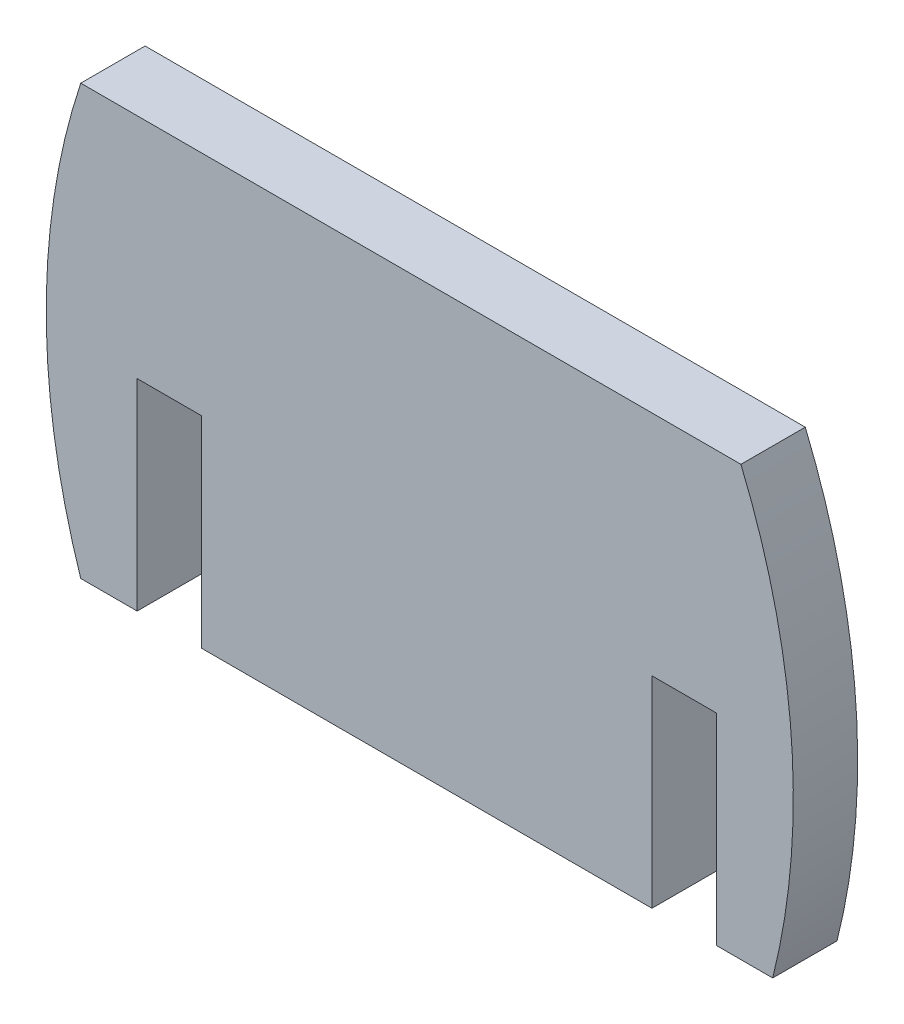
ISO-10303-21;
HEADER;
FILE_DESCRIPTION(('STEP AP214'),'2;1');
FILE_NAME('part.step','',(''),(''),'','','');
FILE_SCHEMA(('AUTOMOTIVE_DESIGN { 1 0 10303 214 1 1 1 1 }'));
ENDSEC;
DATA;
#1=APPLICATION_CONTEXT('core data for automotive mechanical design processes');
#2=APPLICATION_PROTOCOL_DEFINITION('international standard','automotive_design',2000,#1);
#3=PRODUCT_CONTEXT('',#1,'mechanical');
#4=PRODUCT('Part','Part','',(#3));
#5=PRODUCT_RELATED_PRODUCT_CATEGORY('part','',(#4));
#6=PRODUCT_DEFINITION_FORMATION('','',#4);
#7=PRODUCT_DEFINITION_CONTEXT('part definition',#1,'design');
#8=PRODUCT_DEFINITION('design','',#6,#7);
#9=PRODUCT_DEFINITION_SHAPE('','',#8);
#10=(LENGTH_UNIT() NAMED_UNIT(*) SI_UNIT(.MILLI.,.METRE.));
#11=(NAMED_UNIT(*) PLANE_ANGLE_UNIT() SI_UNIT($,.RADIAN.));
#12=(NAMED_UNIT(*) SI_UNIT($,.STERADIAN.) SOLID_ANGLE_UNIT());
#13=UNCERTAINTY_MEASURE_WITH_UNIT(LENGTH_MEASURE(1.E-05),#10,'distance_accuracy_value','');
#14=(GEOMETRIC_REPRESENTATION_CONTEXT(3) GLOBAL_UNCERTAINTY_ASSIGNED_CONTEXT((#13)) GLOBAL_UNIT_ASSIGNED_CONTEXT((#10,
#11,#12)) REPRESENTATION_CONTEXT('',''));
#15=CARTESIAN_POINT('',(0.,0.,0.));
#16=DIRECTION('',(0.,0.,1.));
#17=DIRECTION('',(1.,0.,0.));
#18=AXIS2_PLACEMENT_3D('',#15,#16,#17);
#19=CARTESIAN_POINT('',(905.965375707965,-101.027413416777,3.00000000000009));
#20=DIRECTION('',(1.,0.,0.));
#21=DIRECTION('',(0.,0.,-1.));
#22=AXIS2_PLACEMENT_3D('',#19,#20,#21);
#23=PLANE('',#22);
#24=DIRECTION('',(0.,-1.,0.));
#25=VECTOR('',#24,1.);
#26=CARTESIAN_POINT('',(905.965375707965,-101.027413416777,0.));
#27=LINE('',#26,#25);
#28=CARTESIAN_POINT('',(905.965375707965,-101.027413416777,0.));
#29=VERTEX_POINT('',#28);
#30=CARTESIAN_POINT('',(905.965375707965,-110.414681889517,0.));
#31=VERTEX_POINT('',#30);
#32=EDGE_CURVE('E124',#29,#31,#27,.T.);
#33=ORIENTED_EDGE('',*,*,#32,.T.);
#34=DIRECTION('',(0.,0.,-1.));
#35=VECTOR('',#34,1.);
#36=CARTESIAN_POINT('',(905.965375707965,-110.414681889517,3.00000000000004));
#37=LINE('',#36,#35);
#38=CARTESIAN_POINT('',(905.965375707965,-110.414681889517,3.00000000000004));
#39=VERTEX_POINT('',#38);
#40=EDGE_CURVE('E11',#39,#31,#37,.T.);
#41=ORIENTED_EDGE('',*,*,#40,.F.);
#42=DIRECTION('',(0.,-1.,0.));
#43=VECTOR('',#42,1.);
#44=CARTESIAN_POINT('',(905.965375707965,-101.027413416777,3.00000000000009));
#45=LINE('',#44,#43);
#46=CARTESIAN_POINT('',(905.965375707965,-101.027413416777,3.00000000000009));
#47=VERTEX_POINT('',#46);
#48=EDGE_CURVE('E160',#47,#39,#45,.T.);
#49=ORIENTED_EDGE('',*,*,#48,.F.);
#50=DIRECTION('',(0.,0.,-1.));
#51=VECTOR('',#50,1.);
#52=CARTESIAN_POINT('',(905.965375707965,-101.027413416777,3.00000000000009));
#53=LINE('',#52,#51);
#54=EDGE_CURVE('E137',#47,#29,#53,.T.);
#55=ORIENTED_EDGE('',*,*,#54,.T.);
#56=EDGE_LOOP('',(#33,#41,#49,#55));
#57=FACE_BOUND('',#56,.T.);
#58=ADVANCED_FACE('F32',(#57),#23,.F.);
#59=CARTESIAN_POINT('',(905.965375707965,-110.414681889517,3.00000000000004));
#60=DIRECTION('',(0.,1.,0.));
#61=DIRECTION('',(0.,0.,1.));
#62=AXIS2_PLACEMENT_3D('',#59,#60,#61);
#63=PLANE('',#62);
#64=DIRECTION('',(1.,0.,0.));
#65=VECTOR('',#64,1.);
#66=CARTESIAN_POINT('',(905.965375707965,-110.414681889517,0.));
#67=LINE('',#66,#65);
#68=CARTESIAN_POINT('',(908.594990658527,-110.414681889517,0.));
#69=VERTEX_POINT('',#68);
#70=EDGE_CURVE('E120',#31,#69,#67,.T.);
#71=ORIENTED_EDGE('',*,*,#70,.T.);
#72=DIRECTION('',(0.,0.,-1.));
#73=VECTOR('',#72,1.);
#74=CARTESIAN_POINT('',(908.594990658527,-110.414681889517,3.00000000000011));
#75=LINE('',#74,#73);
#76=CARTESIAN_POINT('',(908.594990658527,-110.414681889517,3.00000000000011));
#77=VERTEX_POINT('',#76);
#78=EDGE_CURVE('E39',#77,#69,#75,.T.);
#79=ORIENTED_EDGE('',*,*,#78,.F.);
#80=DIRECTION('',(1.,0.,0.));
#81=VECTOR('',#80,1.);
#82=CARTESIAN_POINT('',(905.965375707965,-110.414681889517,3.00000000000004));
#83=LINE('',#82,#81);
#84=EDGE_CURVE('E133',#39,#77,#83,.T.);
#85=ORIENTED_EDGE('',*,*,#84,.F.);
#86=ORIENTED_EDGE('',*,*,#40,.T.);
#87=EDGE_LOOP('',(#71,#79,#85,#86));
#88=FACE_BOUND('',#87,.T.);
#89=ADVANCED_FACE('F132',(#88),#63,.F.);
#90=CARTESIAN_POINT('',(877.680521732813,-102.649008524701,3.00000000000016));
#91=DIRECTION('',(0.,0.,-1.));
#92=DIRECTION('',(-1.,0.,0.));
#93=AXIS2_PLACEMENT_3D('',#90,#91,#92);
#94=CYLINDRICAL_SURFACE('',#93,31.8749128903584);
#95=CARTESIAN_POINT('',(877.680521732813,-102.649008524701,1.11022302462516E-13));
#96=DIRECTION('',(0.,0.,1.));
#97=DIRECTION('',(1.,0.,0.));
#98=AXIS2_PLACEMENT_3D('',#95,#96,#97);
#99=CIRCLE('',#98,31.8749128903584);
#100=CARTESIAN_POINT('',(907.114028549901,-90.4146818895168,0.));
#101=VERTEX_POINT('',#100);
#102=EDGE_CURVE('E126',#69,#101,#99,.T.);
#103=ORIENTED_EDGE('',*,*,#102,.T.);
#104=DIRECTION('',(0.,0.,-1.));
#105=VECTOR('',#104,1.);
#106=CARTESIAN_POINT('',(907.114028549901,-90.4146818895168,3.0000000000001));
#107=LINE('',#106,#105);
#108=CARTESIAN_POINT('',(907.114028549901,-90.4146818895168,3.0000000000001));
#109=VERTEX_POINT('',#108);
#110=EDGE_CURVE('E206',#109,#101,#107,.T.);
#111=ORIENTED_EDGE('',*,*,#110,.F.);
#112=CARTESIAN_POINT('',(877.680521732813,-102.649008524701,3.00000000000016));
#113=DIRECTION('',(0.,0.,1.));
#114=DIRECTION('',(1.,0.,0.));
#115=AXIS2_PLACEMENT_3D('',#112,#113,#114);
#116=CIRCLE('',#115,31.8749128903584);
#117=EDGE_CURVE('E163',#77,#109,#116,.T.);
#118=ORIENTED_EDGE('',*,*,#117,.F.);
#119=ORIENTED_EDGE('',*,*,#78,.T.);
#120=EDGE_LOOP('',(#103,#111,#118,#119));
#121=FACE_BOUND('',#120,.T.);
#122=ADVANCED_FACE('F210',(#121),#94,.T.);
#123=CARTESIAN_POINT('',(876.335760757402,-90.4146818895168,3.00000000000011));
#124=DIRECTION('',(0.,-1.,0.));
#125=DIRECTION('',(1.,0.,0.));
#126=AXIS2_PLACEMENT_3D('',#123,#124,#125);
#127=PLANE('',#126);
#128=DIRECTION('',(-1.,0.,0.));
#129=VECTOR('',#128,1.);
#130=CARTESIAN_POINT('',(876.335760757402,-90.4146818895167,0.));
#131=LINE('',#130,#129);
#132=CARTESIAN_POINT('',(876.335760757402,-90.4146818895167,0.));
#133=VERTEX_POINT('',#132);
#134=EDGE_CURVE('E141',#101,#133,#131,.T.);
#135=ORIENTED_EDGE('',*,*,#134,.T.);
#136=DIRECTION('',(0.,0.,-1.));
#137=VECTOR('',#136,1.);
#138=CARTESIAN_POINT('',(876.335760757402,-90.4146818895168,3.00000000000011));
#139=LINE('',#138,#137);
#140=CARTESIAN_POINT('',(876.335760757402,-90.4146818895168,3.00000000000011));
#141=VERTEX_POINT('',#140);
#142=EDGE_CURVE('E203',#141,#133,#139,.T.);
#143=ORIENTED_EDGE('',*,*,#142,.F.);
#144=DIRECTION('',(-1.,0.,0.));
#145=VECTOR('',#144,1.);
#146=CARTESIAN_POINT('',(876.335760757402,-90.4146818895168,3.00000000000011));
#147=LINE('',#146,#145);
#148=EDGE_CURVE('E165',#109,#141,#147,.T.);
#149=ORIENTED_EDGE('',*,*,#148,.F.);
#150=ORIENTED_EDGE('',*,*,#110,.T.);
#151=EDGE_LOOP('',(#135,#143,#149,#150));
#152=FACE_BOUND('',#151,.T.);
#153=ADVANCED_FACE('F218',(#152),#127,.F.);
#154=CARTESIAN_POINT('',(906.601419048078,-100.414681889517,3.00000000000017));
#155=DIRECTION('',(0.,0.,-1.));
#156=DIRECTION('',(-1.,0.,0.));
#157=AXIS2_PLACEMENT_3D('',#154,#155,#156);
#158=CYLINDRICAL_SURFACE('',#157,31.8749128903585);
#159=CARTESIAN_POINT('',(906.601419048078,-100.414681889517,1.38777878078145E-13));
#160=DIRECTION('',(0.,0.,1.));
#161=DIRECTION('',(1.,0.,0.));
#162=AXIS2_PLACEMENT_3D('',#159,#160,#161);
#163=CIRCLE('',#162,31.8749128903585);
#164=CARTESIAN_POINT('',(876.335760757402,-110.414681889517,1.11022302462516E-13));
#165=VERTEX_POINT('',#164);
#166=EDGE_CURVE('E143',#133,#165,#163,.T.);
#167=ORIENTED_EDGE('',*,*,#166,.T.);
#168=DIRECTION('',(0.,0.,-1.));
#169=VECTOR('',#168,1.);
#170=CARTESIAN_POINT('',(876.335760757402,-110.414681889517,3.00000000000007));
#171=LINE('',#170,#169);
#172=CARTESIAN_POINT('',(876.335760757402,-110.414681889517,3.00000000000007));
#173=VERTEX_POINT('',#172);
#174=EDGE_CURVE('E200',#173,#165,#171,.T.);
#175=ORIENTED_EDGE('',*,*,#174,.F.);
#176=CARTESIAN_POINT('',(906.601419048078,-100.414681889517,3.00000000000017));
#177=DIRECTION('',(0.,0.,1.));
#178=DIRECTION('',(1.,0.,0.));
#179=AXIS2_PLACEMENT_3D('',#176,#177,#178);
#180=CIRCLE('',#179,31.8749128903585);
#181=EDGE_CURVE('E167',#141,#173,#180,.T.);
#182=ORIENTED_EDGE('',*,*,#181,.F.);
#183=ORIENTED_EDGE('',*,*,#142,.T.);
#184=EDGE_LOOP('',(#167,#175,#182,#183));
#185=FACE_BOUND('',#184,.T.);
#186=ADVANCED_FACE('F221',(#185),#158,.T.);
#187=CARTESIAN_POINT('',(878.965375707965,-110.414681889517,3.00000000000007));
#188=DIRECTION('',(0.,1.,0.));
#189=DIRECTION('',(0.,0.,1.));
#190=AXIS2_PLACEMENT_3D('',#187,#188,#189);
#191=PLANE('',#190);
#192=DIRECTION('',(1.,0.,0.));
#193=VECTOR('',#192,1.);
#194=CARTESIAN_POINT('',(878.965375707965,-110.414681889517,0.));
#195=LINE('',#194,#193);
#196=CARTESIAN_POINT('',(878.965375707965,-110.414681889517,0.));
#197=VERTEX_POINT('',#196);
#198=EDGE_CURVE('E145',#165,#197,#195,.T.);
#199=ORIENTED_EDGE('',*,*,#198,.T.);
#200=DIRECTION('',(0.,0.,-1.));
#201=VECTOR('',#200,1.);
#202=CARTESIAN_POINT('',(878.965375707965,-110.414681889517,3.00000000000007));
#203=LINE('',#202,#201);
#204=CARTESIAN_POINT('',(878.965375707965,-110.414681889517,3.00000000000007));
#205=VERTEX_POINT('',#204);
#206=EDGE_CURVE('E197',#205,#197,#203,.T.);
#207=ORIENTED_EDGE('',*,*,#206,.F.);
#208=DIRECTION('',(1.,0.,0.));
#209=VECTOR('',#208,1.);
#210=CARTESIAN_POINT('',(878.965375707965,-110.414681889517,3.00000000000007));
#211=LINE('',#210,#209);
#212=EDGE_CURVE('E169',#173,#205,#211,.T.);
#213=ORIENTED_EDGE('',*,*,#212,.F.);
#214=ORIENTED_EDGE('',*,*,#174,.T.);
#215=EDGE_LOOP('',(#199,#207,#213,#214));
#216=FACE_BOUND('',#215,.T.);
#217=ADVANCED_FACE('F226',(#216),#191,.F.);
#218=CARTESIAN_POINT('',(878.965375707965,-101.027413416777,3.0000000000001));
#219=DIRECTION('',(-1.,0.,0.));
#220=DIRECTION('',(0.,0.,1.));
#221=AXIS2_PLACEMENT_3D('',#218,#219,#220);
#222=PLANE('',#221);
#223=DIRECTION('',(0.,1.,0.));
#224=VECTOR('',#223,1.);
#225=CARTESIAN_POINT('',(878.965375707965,-101.027413416777,0.));
#226=LINE('',#225,#224);
#227=CARTESIAN_POINT('',(878.965375707965,-101.027413416777,0.));
#228=VERTEX_POINT('',#227);
#229=EDGE_CURVE('E147',#197,#228,#226,.T.);
#230=ORIENTED_EDGE('',*,*,#229,.T.);
#231=DIRECTION('',(0.,0.,-1.));
#232=VECTOR('',#231,1.);
#233=CARTESIAN_POINT('',(878.965375707965,-101.027413416777,3.0000000000001));
#234=LINE('',#233,#232);
#235=CARTESIAN_POINT('',(878.965375707965,-101.027413416777,3.0000000000001));
#236=VERTEX_POINT('',#235);
#237=EDGE_CURVE('E194',#236,#228,#234,.T.);
#238=ORIENTED_EDGE('',*,*,#237,.F.);
#239=DIRECTION('',(0.,1.,0.));
#240=VECTOR('',#239,1.);
#241=CARTESIAN_POINT('',(878.965375707965,-101.027413416777,3.0000000000001));
#242=LINE('',#241,#240);
#243=EDGE_CURVE('E171',#205,#236,#242,.T.);
#244=ORIENTED_EDGE('',*,*,#243,.F.);
#245=ORIENTED_EDGE('',*,*,#206,.T.);
#246=EDGE_LOOP('',(#230,#238,#244,#245));
#247=FACE_BOUND('',#246,.T.);
#248=ADVANCED_FACE('F232',(#247),#222,.F.);
#249=CARTESIAN_POINT('',(881.965375707965,-101.027413416777,3.00000000000016));
#250=DIRECTION('',(0.,1.,0.));
#251=DIRECTION('',(0.,0.,1.));
#252=AXIS2_PLACEMENT_3D('',#249,#250,#251);
#253=PLANE('',#252);
#254=DIRECTION('',(1.,0.,0.));
#255=VECTOR('',#254,1.);
#256=CARTESIAN_POINT('',(881.965375707965,-101.027413416777,0.));
#257=LINE('',#256,#255);
#258=CARTESIAN_POINT('',(881.965375707965,-101.027413416777,0.));
#259=VERTEX_POINT('',#258);
#260=EDGE_CURVE('E149',#228,#259,#257,.T.);
#261=ORIENTED_EDGE('',*,*,#260,.T.);
#262=DIRECTION('',(0.,0.,-1.));
#263=VECTOR('',#262,1.);
#264=CARTESIAN_POINT('',(881.965375707965,-101.027413416777,3.00000000000016));
#265=LINE('',#264,#263);
#266=CARTESIAN_POINT('',(881.965375707965,-101.027413416777,3.00000000000016));
#267=VERTEX_POINT('',#266);
#268=EDGE_CURVE('E191',#267,#259,#265,.T.);
#269=ORIENTED_EDGE('',*,*,#268,.F.);
#270=DIRECTION('',(1.,0.,0.));
#271=VECTOR('',#270,1.);
#272=CARTESIAN_POINT('',(881.965375707965,-101.027413416777,3.00000000000016));
#273=LINE('',#272,#271);
#274=EDGE_CURVE('E173',#236,#267,#273,.T.);
#275=ORIENTED_EDGE('',*,*,#274,.F.);
#276=ORIENTED_EDGE('',*,*,#237,.T.);
#277=EDGE_LOOP('',(#261,#269,#275,#276));
#278=FACE_BOUND('',#277,.T.);
#279=ADVANCED_FACE('F236',(#278),#253,.F.);
#280=CARTESIAN_POINT('',(881.965375707965,-110.414681889517,3.00000000000007));
#281=DIRECTION('',(1.,0.,0.));
#282=DIRECTION('',(0.,0.,-1.));
#283=AXIS2_PLACEMENT_3D('',#280,#281,#282);
#284=PLANE('',#283);
#285=DIRECTION('',(0.,-1.,0.));
#286=VECTOR('',#285,1.);
#287=CARTESIAN_POINT('',(881.965375707965,-110.414681889517,1.38777878078145E-13));
#288=LINE('',#287,#286);
#289=CARTESIAN_POINT('',(881.965375707965,-110.414681889517,1.38777878078145E-13));
#290=VERTEX_POINT('',#289);
#291=EDGE_CURVE('E151',#259,#290,#288,.T.);
#292=ORIENTED_EDGE('',*,*,#291,.T.);
#293=DIRECTION('',(0.,0.,-1.));
#294=VECTOR('',#293,1.);
#295=CARTESIAN_POINT('',(881.965375707965,-110.414681889517,3.00000000000007));
#296=LINE('',#295,#294);
#297=CARTESIAN_POINT('',(881.965375707965,-110.414681889517,3.00000000000007));
#298=VERTEX_POINT('',#297);
#299=EDGE_CURVE('E188',#298,#290,#296,.T.);
#300=ORIENTED_EDGE('',*,*,#299,.F.);
#301=DIRECTION('',(0.,-1.,0.));
#302=VECTOR('',#301,1.);
#303=CARTESIAN_POINT('',(881.965375707965,-110.414681889517,3.00000000000007));
#304=LINE('',#303,#302);
#305=EDGE_CURVE('E175',#267,#298,#304,.T.);
#306=ORIENTED_EDGE('',*,*,#305,.F.);
#307=ORIENTED_EDGE('',*,*,#268,.T.);
#308=EDGE_LOOP('',(#292,#300,#306,#307));
#309=FACE_BOUND('',#308,.T.);
#310=ADVANCED_FACE('F241',(#309),#284,.F.);
#311=CARTESIAN_POINT('',(892.465375707965,-110.414681889517,3.0000000000001));
#312=DIRECTION('',(0.,1.,0.));
#313=DIRECTION('',(0.,0.,1.));
#314=AXIS2_PLACEMENT_3D('',#311,#312,#313);
#315=PLANE('',#314);
#316=DIRECTION('',(1.,0.,0.));
#317=VECTOR('',#316,1.);
#318=CARTESIAN_POINT('',(892.465375707965,-110.414681889517,0.));
#319=LINE('',#318,#317);
#320=CARTESIAN_POINT('',(902.965375707965,-110.414681889517,1.38777878078145E-13));
#321=VERTEX_POINT('',#320);
#322=EDGE_CURVE('E154',#290,#321,#319,.T.);
#323=ORIENTED_EDGE('',*,*,#322,.T.);
#324=DIRECTION('',(0.,0.,-1.));
#325=VECTOR('',#324,1.);
#326=CARTESIAN_POINT('',(902.965375707965,-110.414681889517,3.0000000000001));
#327=LINE('',#326,#325);
#328=CARTESIAN_POINT('',(902.965375707965,-110.414681889517,3.0000000000001));
#329=VERTEX_POINT('',#328);
#330=EDGE_CURVE('E185',#329,#321,#327,.T.);
#331=ORIENTED_EDGE('',*,*,#330,.F.);
#332=DIRECTION('',(1.,0.,0.));
#333=VECTOR('',#332,1.);
#334=CARTESIAN_POINT('',(892.465375707965,-110.414681889517,3.0000000000001));
#335=LINE('',#334,#333);
#336=EDGE_CURVE('E177',#298,#329,#335,.T.);
#337=ORIENTED_EDGE('',*,*,#336,.F.);
#338=ORIENTED_EDGE('',*,*,#299,.T.);
#339=EDGE_LOOP('',(#323,#331,#337,#338));
#340=FACE_BOUND('',#339,.T.);
#341=ADVANCED_FACE('F245',(#340),#315,.F.);
#342=CARTESIAN_POINT('',(902.965375707965,-110.414681889517,3.0000000000001));
#343=DIRECTION('',(-1.,0.,0.));
#344=DIRECTION('',(0.,0.,1.));
#345=AXIS2_PLACEMENT_3D('',#342,#343,#344);
#346=PLANE('',#345);
#347=DIRECTION('',(0.,1.,0.));
#348=VECTOR('',#347,1.);
#349=CARTESIAN_POINT('',(902.965375707965,-110.414681889517,1.38777878078145E-13));
#350=LINE('',#349,#348);
#351=CARTESIAN_POINT('',(902.965375707965,-101.027413416777,1.66533453693773E-13));
#352=VERTEX_POINT('',#351);
#353=EDGE_CURVE('E156',#321,#352,#350,.T.);
#354=ORIENTED_EDGE('',*,*,#353,.T.);
#355=DIRECTION('',(0.,0.,-1.));
#356=VECTOR('',#355,1.);
#357=CARTESIAN_POINT('',(902.965375707965,-101.027413416777,3.00000000000021));
#358=LINE('',#357,#356);
#359=CARTESIAN_POINT('',(902.965375707965,-101.027413416777,3.00000000000021));
#360=VERTEX_POINT('',#359);
#361=EDGE_CURVE('E182',#360,#352,#358,.T.);
#362=ORIENTED_EDGE('',*,*,#361,.F.);
#363=DIRECTION('',(0.,1.,0.));
#364=VECTOR('',#363,1.);
#365=CARTESIAN_POINT('',(902.965375707965,-110.414681889517,3.0000000000001));
#366=LINE('',#365,#364);
#367=EDGE_CURVE('E51',#329,#360,#366,.T.);
#368=ORIENTED_EDGE('',*,*,#367,.F.);
#369=ORIENTED_EDGE('',*,*,#330,.T.);
#370=EDGE_LOOP('',(#354,#362,#368,#369));
#371=FACE_BOUND('',#370,.T.);
#372=ADVANCED_FACE('F248',(#371),#346,.F.);
#373=CARTESIAN_POINT('',(902.965375707965,-101.027413416777,3.00000000000021));
#374=DIRECTION('',(0.,1.,0.));
#375=DIRECTION('',(0.,0.,1.));
#376=AXIS2_PLACEMENT_3D('',#373,#374,#375);
#377=PLANE('',#376);
#378=DIRECTION('',(1.,0.,0.));
#379=VECTOR('',#378,1.);
#380=CARTESIAN_POINT('',(902.965375707965,-101.027413416777,1.66533453693773E-13));
#381=LINE('',#380,#379);
#382=EDGE_CURVE('E158',#352,#29,#381,.T.);
#383=ORIENTED_EDGE('',*,*,#382,.T.);
#384=ORIENTED_EDGE('',*,*,#54,.F.);
#385=DIRECTION('',(1.,0.,0.));
#386=VECTOR('',#385,1.);
#387=CARTESIAN_POINT('',(902.965375707965,-101.027413416777,3.00000000000021));
#388=LINE('',#387,#386);
#389=EDGE_CURVE('E46',#360,#47,#388,.T.);
#390=ORIENTED_EDGE('',*,*,#389,.F.);
#391=ORIENTED_EDGE('',*,*,#361,.T.);
#392=EDGE_LOOP('',(#383,#384,#390,#391));
#393=FACE_BOUND('',#392,.T.);
#394=ADVANCED_FACE('F250',(#393),#377,.F.);
#395=CARTESIAN_POINT('',(877.680521732813,-102.649008524701,3.00000000000016));
#396=DIRECTION('',(0.,0.,1.));
#397=DIRECTION('',(1.,0.,0.));
#398=AXIS2_PLACEMENT_3D('',#395,#396,#397);
#399=PLANE('',#398);
#400=ORIENTED_EDGE('',*,*,#48,.T.);
#401=ORIENTED_EDGE('',*,*,#84,.T.);
#402=ORIENTED_EDGE('',*,*,#117,.T.);
#403=ORIENTED_EDGE('',*,*,#148,.T.);
#404=ORIENTED_EDGE('',*,*,#181,.T.);
#405=ORIENTED_EDGE('',*,*,#212,.T.);
#406=ORIENTED_EDGE('',*,*,#243,.T.);
#407=ORIENTED_EDGE('',*,*,#274,.T.);
#408=ORIENTED_EDGE('',*,*,#305,.T.);
#409=ORIENTED_EDGE('',*,*,#336,.T.);
#410=ORIENTED_EDGE('',*,*,#367,.T.);
#411=ORIENTED_EDGE('',*,*,#389,.T.);
#412=EDGE_LOOP('',(#400,#401,#402,#403,#404,#405,#406,#407,#408,#409,#410,#411));
#413=FACE_BOUND('',#412,.T.);
#414=ADVANCED_FACE('F213',(#413),#399,.T.);
#415=CARTESIAN_POINT('',(877.680521732813,-102.649008524701,1.11022302462516E-13));
#416=DIRECTION('',(0.,0.,1.));
#417=DIRECTION('',(1.,0.,0.));
#418=AXIS2_PLACEMENT_3D('',#415,#416,#417);
#419=PLANE('',#418);
#420=ORIENTED_EDGE('',*,*,#32,.F.);
#421=ORIENTED_EDGE('',*,*,#382,.F.);
#422=ORIENTED_EDGE('',*,*,#353,.F.);
#423=ORIENTED_EDGE('',*,*,#322,.F.);
#424=ORIENTED_EDGE('',*,*,#291,.F.);
#425=ORIENTED_EDGE('',*,*,#260,.F.);
#426=ORIENTED_EDGE('',*,*,#229,.F.);
#427=ORIENTED_EDGE('',*,*,#198,.F.);
#428=ORIENTED_EDGE('',*,*,#166,.F.);
#429=ORIENTED_EDGE('',*,*,#134,.F.);
#430=ORIENTED_EDGE('',*,*,#102,.F.);
#431=ORIENTED_EDGE('',*,*,#70,.F.);
#432=EDGE_LOOP('',(#420,#421,#422,#423,#424,#425,#426,#427,#428,#429,#430,#431));
#433=FACE_BOUND('',#432,.T.);
#434=ADVANCED_FACE('F121',(#433),#419,.F.);
#435=CLOSED_SHELL('',(#58,#89,#122,#153,#186,#217,#248,#279,#310,#341,#372,#394,#414,#434));
#436=MANIFOLD_SOLID_BREP('B2',#435);
#437=ADVANCED_BREP_SHAPE_REPRESENTATION('',(#18,#436),#14);
#438=SHAPE_DEFINITION_REPRESENTATION(#9,#437);
ENDSEC;
END-ISO-10303-21;
